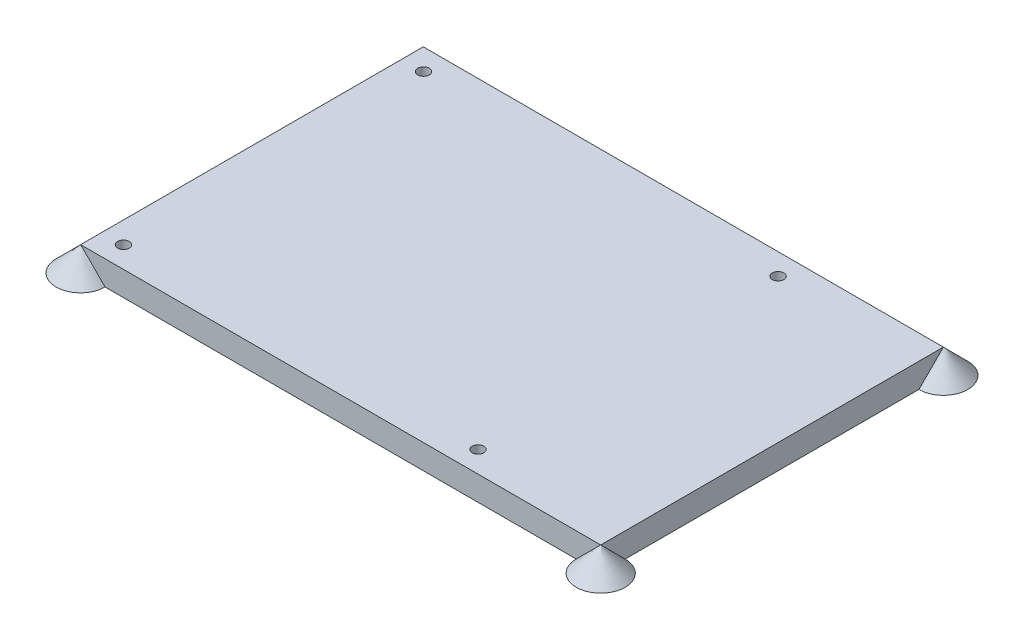
ISO-10303-21;
HEADER;
FILE_DESCRIPTION(('STEP AP214'),'2;1');
FILE_NAME('part.step','',(''),(''),'','','');
FILE_SCHEMA(('AUTOMOTIVE_DESIGN { 1 0 10303 214 1 1 1 1 }'));
ENDSEC;
DATA;
#1=APPLICATION_CONTEXT('core data for automotive mechanical design processes');
#2=APPLICATION_PROTOCOL_DEFINITION('international standard','automotive_design',2000,#1);
#3=PRODUCT_CONTEXT('',#1,'mechanical');
#4=PRODUCT('Part','Part','',(#3));
#5=PRODUCT_RELATED_PRODUCT_CATEGORY('part','',(#4));
#6=PRODUCT_DEFINITION_FORMATION('','',#4);
#7=PRODUCT_DEFINITION_CONTEXT('part definition',#1,'design');
#8=PRODUCT_DEFINITION('design','',#6,#7);
#9=PRODUCT_DEFINITION_SHAPE('','',#8);
#10=(LENGTH_UNIT() NAMED_UNIT(*) SI_UNIT(.MILLI.,.METRE.));
#11=(NAMED_UNIT(*) PLANE_ANGLE_UNIT() SI_UNIT($,.RADIAN.));
#12=(NAMED_UNIT(*) SI_UNIT($,.STERADIAN.) SOLID_ANGLE_UNIT());
#13=UNCERTAINTY_MEASURE_WITH_UNIT(LENGTH_MEASURE(1.E-05),#10,'distance_accuracy_value','');
#14=(GEOMETRIC_REPRESENTATION_CONTEXT(3) GLOBAL_UNCERTAINTY_ASSIGNED_CONTEXT((#13)) GLOBAL_UNIT_ASSIGNED_CONTEXT((#10,
#11,#12)) REPRESENTATION_CONTEXT('',''));
#15=CARTESIAN_POINT('',(0.,0.,0.));
#16=DIRECTION('',(0.,0.,1.));
#17=DIRECTION('',(1.,0.,0.));
#18=AXIS2_PLACEMENT_3D('',#15,#16,#17);
#19=CARTESIAN_POINT('',(42.5,4.,28.));
#20=DIRECTION('',(-1.,0.,0.));
#21=DIRECTION('',(0.,0.,1.));
#22=AXIS2_PLACEMENT_3D('',#19,#20,#21);
#23=PLANE('',#22);
#24=DIRECTION('',(0.,0.707106781186547,-0.707106781186548));
#25=VECTOR('',#24,1.);
#26=CARTESIAN_POINT('',(42.5,4.,-28.));
#27=LINE('',#26,#25);
#28=CARTESIAN_POINT('',(42.5,4.,-28.));
#29=VERTEX_POINT('',#28);
#30=CARTESIAN_POINT('',(42.5,0.,-24.));
#31=VERTEX_POINT('',#30);
#32=EDGE_CURVE('E129',#29,#31,#27,.F.);
#33=ORIENTED_EDGE('',*,*,#32,.F.);
#34=DIRECTION('',(0.,0.,-1.));
#35=VECTOR('',#34,1.);
#36=CARTESIAN_POINT('',(42.5,4.,28.));
#37=LINE('',#36,#35);
#38=CARTESIAN_POINT('',(42.5,4.,28.));
#39=VERTEX_POINT('',#38);
#40=EDGE_CURVE('E112',#39,#29,#37,.T.);
#41=ORIENTED_EDGE('',*,*,#40,.F.);
#42=DIRECTION('',(0.,-0.707106781186547,-0.707106781186548));
#43=VECTOR('',#42,1.);
#44=CARTESIAN_POINT('',(42.5,4.,28.));
#45=LINE('',#44,#43);
#46=CARTESIAN_POINT('',(42.5,0.,24.));
#47=VERTEX_POINT('',#46);
#48=EDGE_CURVE('E11',#47,#39,#45,.F.);
#49=ORIENTED_EDGE('',*,*,#48,.F.);
#50=DIRECTION('',(0.,0.,-1.));
#51=VECTOR('',#50,1.);
#52=CARTESIAN_POINT('',(42.5,0.,28.));
#53=LINE('',#52,#51);
#54=EDGE_CURVE('E68',#47,#31,#53,.T.);
#55=ORIENTED_EDGE('',*,*,#54,.T.);
#56=EDGE_LOOP('',(#33,#41,#49,#55));
#57=FACE_BOUND('',#56,.T.);
#58=ADVANCED_FACE('F45',(#57),#23,.F.);
#59=CARTESIAN_POINT('',(-42.5,4.,-28.));
#60=DIRECTION('',(0.,0.,1.));
#61=DIRECTION('',(1.,0.,0.));
#62=AXIS2_PLACEMENT_3D('',#59,#60,#61);
#63=PLANE('',#62);
#64=DIRECTION('',(-0.707106781186548,-0.707106781186547,0.));
#65=VECTOR('',#64,1.);
#66=CARTESIAN_POINT('',(42.5,4.,-28.));
#67=LINE('',#66,#65);
#68=CARTESIAN_POINT('',(38.5,0.,-28.));
#69=VERTEX_POINT('',#68);
#70=EDGE_CURVE('E60',#69,#29,#67,.F.);
#71=ORIENTED_EDGE('',*,*,#70,.F.);
#72=DIRECTION('',(-1.,0.,0.));
#73=VECTOR('',#72,1.);
#74=CARTESIAN_POINT('',(-42.5,0.,-28.));
#75=LINE('',#74,#73);
#76=CARTESIAN_POINT('',(-38.5,0.,-28.));
#77=VERTEX_POINT('',#76);
#78=EDGE_CURVE('E313',#69,#77,#75,.T.);
#79=ORIENTED_EDGE('',*,*,#78,.T.);
#80=DIRECTION('',(-0.707106781186548,0.707106781186547,0.));
#81=VECTOR('',#80,1.);
#82=CARTESIAN_POINT('',(-42.5,4.,-28.));
#83=LINE('',#82,#81);
#84=CARTESIAN_POINT('',(-42.5,4.,-28.));
#85=VERTEX_POINT('',#84);
#86=EDGE_CURVE('E125',#85,#77,#83,.F.);
#87=ORIENTED_EDGE('',*,*,#86,.F.);
#88=DIRECTION('',(-1.,0.,0.));
#89=VECTOR('',#88,1.);
#90=CARTESIAN_POINT('',(-42.5,4.,-28.));
#91=LINE('',#90,#89);
#92=EDGE_CURVE('E116',#29,#85,#91,.T.);
#93=ORIENTED_EDGE('',*,*,#92,.F.);
#94=EDGE_LOOP('',(#71,#79,#87,#93));
#95=FACE_BOUND('',#94,.T.);
#96=ADVANCED_FACE('F123',(#95),#63,.F.);
#97=CARTESIAN_POINT('',(-42.5,4.,28.));
#98=DIRECTION('',(0.,0.,-1.));
#99=DIRECTION('',(-1.,0.,0.));
#100=AXIS2_PLACEMENT_3D('',#97,#98,#99);
#101=PLANE('',#100);
#102=DIRECTION('',(0.707106781186548,0.707106781186547,0.));
#103=VECTOR('',#102,1.);
#104=CARTESIAN_POINT('',(42.5,4.,28.));
#105=LINE('',#104,#103);
#106=CARTESIAN_POINT('',(38.5,0.,28.));
#107=VERTEX_POINT('',#106);
#108=EDGE_CURVE('E146',#39,#107,#105,.F.);
#109=ORIENTED_EDGE('',*,*,#108,.F.);
#110=DIRECTION('',(1.,0.,0.));
#111=VECTOR('',#110,1.);
#112=CARTESIAN_POINT('',(-42.5,4.,28.));
#113=LINE('',#112,#111);
#114=CARTESIAN_POINT('',(-42.5,4.,28.));
#115=VERTEX_POINT('',#114);
#116=EDGE_CURVE('E118',#115,#39,#113,.T.);
#117=ORIENTED_EDGE('',*,*,#116,.F.);
#118=DIRECTION('',(0.707106781186548,-0.707106781186547,0.));
#119=VECTOR('',#118,1.);
#120=CARTESIAN_POINT('',(-42.5,4.,28.));
#121=LINE('',#120,#119);
#122=CARTESIAN_POINT('',(-38.5,0.,28.));
#123=VERTEX_POINT('',#122);
#124=EDGE_CURVE('E164',#123,#115,#121,.F.);
#125=ORIENTED_EDGE('',*,*,#124,.F.);
#126=DIRECTION('',(1.,0.,0.));
#127=VECTOR('',#126,1.);
#128=CARTESIAN_POINT('',(-42.5,0.,28.));
#129=LINE('',#128,#127);
#130=EDGE_CURVE('E121',#123,#107,#129,.T.);
#131=ORIENTED_EDGE('',*,*,#130,.T.);
#132=EDGE_LOOP('',(#109,#117,#125,#131));
#133=FACE_BOUND('',#132,.T.);
#134=ADVANCED_FACE('F209',(#133),#101,.F.);
#135=CARTESIAN_POINT('',(-42.5,4.,28.));
#136=DIRECTION('',(1.,0.,0.));
#137=DIRECTION('',(0.,0.,-1.));
#138=AXIS2_PLACEMENT_3D('',#135,#136,#137);
#139=PLANE('',#138);
#140=DIRECTION('',(0.,-0.707106781186547,0.707106781186548));
#141=VECTOR('',#140,1.);
#142=CARTESIAN_POINT('',(-42.5,4.,-28.));
#143=LINE('',#142,#141);
#144=CARTESIAN_POINT('',(-42.5,0.,-24.));
#145=VERTEX_POINT('',#144);
#146=EDGE_CURVE('E156',#145,#85,#143,.F.);
#147=ORIENTED_EDGE('',*,*,#146,.F.);
#148=DIRECTION('',(0.,0.,1.));
#149=VECTOR('',#148,1.);
#150=CARTESIAN_POINT('',(-42.5,0.,28.));
#151=LINE('',#150,#149);
#152=CARTESIAN_POINT('',(-42.5,0.,24.));
#153=VERTEX_POINT('',#152);
#154=EDGE_CURVE('E308',#145,#153,#151,.T.);
#155=ORIENTED_EDGE('',*,*,#154,.T.);
#156=DIRECTION('',(0.,0.707106781186547,0.707106781186548));
#157=VECTOR('',#156,1.);
#158=CARTESIAN_POINT('',(-42.5,4.,28.));
#159=LINE('',#158,#157);
#160=EDGE_CURVE('E168',#115,#153,#159,.F.);
#161=ORIENTED_EDGE('',*,*,#160,.F.);
#162=DIRECTION('',(0.,0.,1.));
#163=VECTOR('',#162,1.);
#164=CARTESIAN_POINT('',(-42.5,4.,28.));
#165=LINE('',#164,#163);
#166=EDGE_CURVE('E127',#85,#115,#165,.T.);
#167=ORIENTED_EDGE('',*,*,#166,.F.);
#168=EDGE_LOOP('',(#147,#155,#161,#167));
#169=FACE_BOUND('',#168,.T.);
#170=ADVANCED_FACE('F278',(#169),#139,.F.);
#171=CARTESIAN_POINT('',(-38.98,4.,-24.52));
#172=DIRECTION('',(0.,-1.,0.));
#173=DIRECTION('',(0.,0.,-1.));
#174=AXIS2_PLACEMENT_3D('',#171,#172,#173);
#175=CYLINDRICAL_SURFACE('',#174,0.950000000000001);
#176=CARTESIAN_POINT('',(-38.98,4.,-24.52));
#177=DIRECTION('',(0.,1.,0.));
#178=DIRECTION('',(0.,0.,-1.));
#179=AXIS2_PLACEMENT_3D('',#176,#177,#178);
#180=CIRCLE('',#179,0.950000000000001);
#181=CARTESIAN_POINT('',(-38.98,4.,-25.47));
#182=VERTEX_POINT('',#181);
#183=EDGE_CURVE('E173',#182,#182,#180,.T.);
#184=ORIENTED_EDGE('',*,*,#183,.T.);
#185=EDGE_LOOP('',(#184));
#186=FACE_BOUND('',#185,.T.);
#187=CARTESIAN_POINT('',(-38.98,0.,-24.52));
#188=DIRECTION('',(0.,1.,0.));
#189=DIRECTION('',(0.,0.,-1.));
#190=AXIS2_PLACEMENT_3D('',#187,#188,#189);
#191=CIRCLE('',#190,0.950000000000001);
#192=CARTESIAN_POINT('',(-39.6668957060178,0.,-25.1762577916142));
#193=VERTEX_POINT('',#192);
#194=CARTESIAN_POINT('',(-39.6440649156764,0.,-25.1993510048331));
#195=VERTEX_POINT('',#194);
#196=EDGE_CURVE('E172',#193,#195,#191,.T.);
#197=ORIENTED_EDGE('',*,*,#196,.F.);
#198=CARTESIAN_POINT('',(-39.6440649156764,0.,-25.1993510048331));
#199=DIRECTION('',(-0.703054692657972,0.,0.711135781079538));
#200=VECTOR('',#199,1.);
#201=LINE('',#198,#200);
#202=EDGE_CURVE('E53',#195,#193,#201,.T.);
#203=ORIENTED_EDGE('',*,*,#202,.F.);
#204=EDGE_LOOP('',(#197,#203));
#205=FACE_BOUND('',#204,.T.);
#206=ADVANCED_FACE('F224',(#186,#205),#175,.F.);
#207=CARTESIAN_POINT('',(-38.98,4.,24.52));
#208=DIRECTION('',(0.,-1.,0.));
#209=DIRECTION('',(0.,0.,-1.));
#210=AXIS2_PLACEMENT_3D('',#207,#208,#209);
#211=CYLINDRICAL_SURFACE('',#210,0.950000000000001);
#212=CARTESIAN_POINT('',(-38.98,4.,24.52));
#213=DIRECTION('',(0.,1.,0.));
#214=DIRECTION('',(0.,0.,1.));
#215=AXIS2_PLACEMENT_3D('',#212,#213,#214);
#216=CIRCLE('',#215,0.950000000000001);
#217=CARTESIAN_POINT('',(-38.98,4.,25.47));
#218=VERTEX_POINT('',#217);
#219=EDGE_CURVE('E247',#218,#218,#216,.T.);
#220=ORIENTED_EDGE('',*,*,#219,.T.);
#221=EDGE_LOOP('',(#220));
#222=FACE_BOUND('',#221,.T.);
#223=CARTESIAN_POINT('',(-38.98,0.,24.52));
#224=DIRECTION('',(0.,1.,0.));
#225=DIRECTION('',(0.,0.,1.));
#226=AXIS2_PLACEMENT_3D('',#223,#224,#225);
#227=CIRCLE('',#226,0.950000000000001);
#228=CARTESIAN_POINT('',(-39.6440649156761,0.,25.1993510048334));
#229=VERTEX_POINT('',#228);
#230=CARTESIAN_POINT('',(-39.6668957060177,0.,25.1762577916143));
#231=VERTEX_POINT('',#230);
#232=EDGE_CURVE('E243',#229,#231,#227,.T.);
#233=ORIENTED_EDGE('',*,*,#232,.F.);
#234=CARTESIAN_POINT('',(-39.6668957060177,0.,25.1762577916143));
#235=DIRECTION('',(0.703054692658165,0.,0.711135781079347));
#236=VECTOR('',#235,1.);
#237=LINE('',#234,#236);
#238=EDGE_CURVE('E226',#231,#229,#237,.T.);
#239=ORIENTED_EDGE('',*,*,#238,.F.);
#240=EDGE_LOOP('',(#233,#239));
#241=FACE_BOUND('',#240,.T.);
#242=ADVANCED_FACE('F258',(#222,#241),#211,.F.);
#243=CARTESIAN_POINT('',(0.,4.,0.));
#244=DIRECTION('',(0.,-1.,0.));
#245=DIRECTION('',(0.,0.,-1.));
#246=AXIS2_PLACEMENT_3D('',#243,#244,#245);
#247=PLANE('',#246);
#248=ORIENTED_EDGE('',*,*,#40,.T.);
#249=ORIENTED_EDGE('',*,*,#92,.T.);
#250=ORIENTED_EDGE('',*,*,#166,.T.);
#251=ORIENTED_EDGE('',*,*,#116,.T.);
#252=EDGE_LOOP('',(#248,#249,#250,#251));
#253=FACE_BOUND('',#252,.T.);
#254=ORIENTED_EDGE('',*,*,#219,.F.);
#255=EDGE_LOOP('',(#254));
#256=FACE_BOUND('',#255,.T.);
#257=CARTESIAN_POINT('',(18.96,4.,24.52));
#258=DIRECTION('',(0.,1.,0.));
#259=DIRECTION('',(0.,0.,-1.));
#260=AXIS2_PLACEMENT_3D('',#257,#258,#259);
#261=CIRCLE('',#260,0.950000000000001);
#262=CARTESIAN_POINT('',(18.96,4.,23.57));
#263=VERTEX_POINT('',#262);
#264=EDGE_CURVE('E238',#263,#263,#261,.T.);
#265=ORIENTED_EDGE('',*,*,#264,.F.);
#266=EDGE_LOOP('',(#265));
#267=FACE_BOUND('',#266,.T.);
#268=CARTESIAN_POINT('',(18.96,4.,-24.52));
#269=DIRECTION('',(0.,1.,0.));
#270=DIRECTION('',(0.,0.,1.));
#271=AXIS2_PLACEMENT_3D('',#268,#269,#270);
#272=CIRCLE('',#271,0.950000000000001);
#273=CARTESIAN_POINT('',(18.96,4.,-23.57));
#274=VERTEX_POINT('',#273);
#275=EDGE_CURVE('E180',#274,#274,#272,.T.);
#276=ORIENTED_EDGE('',*,*,#275,.F.);
#277=EDGE_LOOP('',(#276));
#278=FACE_BOUND('',#277,.T.);
#279=ORIENTED_EDGE('',*,*,#183,.F.);
#280=EDGE_LOOP('',(#279));
#281=FACE_BOUND('',#280,.T.);
#282=ADVANCED_FACE('F113',(#253,#256,#267,#278,#281),#247,.F.);
#283=CARTESIAN_POINT('',(0.,0.,0.));
#284=DIRECTION('',(0.,-1.,0.));
#285=DIRECTION('',(0.,0.,-1.));
#286=AXIS2_PLACEMENT_3D('',#283,#284,#285);
#287=PLANE('',#286);
#288=ORIENTED_EDGE('',*,*,#78,.F.);
#289=CARTESIAN_POINT('',(42.5,0.,-28.));
#290=DIRECTION('',(0.,-1.,0.));
#291=DIRECTION('',(0.,0.,1.));
#292=AXIS2_PLACEMENT_3D('',#289,#290,#291);
#293=CIRCLE('',#292,4.00000000000001);
#294=EDGE_CURVE('E137',#69,#31,#293,.T.);
#295=ORIENTED_EDGE('',*,*,#294,.T.);
#296=ORIENTED_EDGE('',*,*,#54,.F.);
#297=CARTESIAN_POINT('',(42.5,0.,28.));
#298=DIRECTION('',(0.,1.,0.));
#299=DIRECTION('',(0.,0.,-1.));
#300=AXIS2_PLACEMENT_3D('',#297,#298,#299);
#301=CIRCLE('',#300,4.00000000000001);
#302=EDGE_CURVE('E134',#107,#47,#301,.T.);
#303=ORIENTED_EDGE('',*,*,#302,.F.);
#304=ORIENTED_EDGE('',*,*,#130,.F.);
#305=CARTESIAN_POINT('',(-42.5,0.,28.));
#306=DIRECTION('',(0.,-1.,0.));
#307=DIRECTION('',(0.,0.,-1.));
#308=AXIS2_PLACEMENT_3D('',#305,#306,#307);
#309=CIRCLE('',#308,4.00000000000001);
#310=EDGE_CURVE('E160',#123,#153,#309,.T.);
#311=ORIENTED_EDGE('',*,*,#310,.T.);
#312=ORIENTED_EDGE('',*,*,#154,.F.);
#313=CARTESIAN_POINT('',(-42.5,0.,-28.));
#314=DIRECTION('',(0.,1.,0.));
#315=DIRECTION('',(0.,0.,1.));
#316=AXIS2_PLACEMENT_3D('',#313,#314,#315);
#317=CIRCLE('',#316,4.00000000000001);
#318=EDGE_CURVE('E150',#77,#145,#317,.T.);
#319=ORIENTED_EDGE('',*,*,#318,.F.);
#320=EDGE_LOOP('',(#288,#295,#296,#303,#304,#311,#312,#319));
#321=FACE_BOUND('',#320,.T.);
#322=ORIENTED_EDGE('',*,*,#202,.T.);
#323=ORIENTED_EDGE('',*,*,#196,.T.);
#324=EDGE_LOOP('',(#322,#323));
#325=FACE_BOUND('',#324,.T.);
#326=ORIENTED_EDGE('',*,*,#238,.T.);
#327=ORIENTED_EDGE('',*,*,#232,.T.);
#328=EDGE_LOOP('',(#326,#327));
#329=FACE_BOUND('',#328,.T.);
#330=CARTESIAN_POINT('',(18.96,0.,-24.52));
#331=DIRECTION('',(0.,1.,0.));
#332=DIRECTION('',(0.,0.,1.));
#333=AXIS2_PLACEMENT_3D('',#330,#331,#332);
#334=CIRCLE('',#333,0.950000000000001);
#335=CARTESIAN_POINT('',(18.96,0.,-23.57));
#336=VERTEX_POINT('',#335);
#337=EDGE_CURVE('E177',#336,#336,#334,.T.);
#338=ORIENTED_EDGE('',*,*,#337,.T.);
#339=EDGE_LOOP('',(#338));
#340=FACE_BOUND('',#339,.T.);
#341=CARTESIAN_POINT('',(18.96,0.,24.52));
#342=DIRECTION('',(0.,1.,0.));
#343=DIRECTION('',(0.,0.,-1.));
#344=AXIS2_PLACEMENT_3D('',#341,#342,#343);
#345=CIRCLE('',#344,0.950000000000001);
#346=CARTESIAN_POINT('',(18.96,0.,23.57));
#347=VERTEX_POINT('',#346);
#348=EDGE_CURVE('E235',#347,#347,#345,.T.);
#349=ORIENTED_EDGE('',*,*,#348,.T.);
#350=EDGE_LOOP('',(#349));
#351=FACE_BOUND('',#350,.T.);
#352=ADVANCED_FACE('F196',(#321,#325,#329,#340,#351),#287,.T.);
#353=CARTESIAN_POINT('',(18.96,4.,24.52));
#354=DIRECTION('',(0.,-1.,0.));
#355=DIRECTION('',(0.,0.,-1.));
#356=AXIS2_PLACEMENT_3D('',#353,#354,#355);
#357=CYLINDRICAL_SURFACE('',#356,0.950000000000001);
#358=ORIENTED_EDGE('',*,*,#264,.T.);
#359=EDGE_LOOP('',(#358));
#360=FACE_BOUND('',#359,.T.);
#361=ORIENTED_EDGE('',*,*,#348,.F.);
#362=EDGE_LOOP('',(#361));
#363=FACE_BOUND('',#362,.T.);
#364=ADVANCED_FACE('F206',(#360,#363),#357,.F.);
#365=CARTESIAN_POINT('',(18.96,4.,-24.52));
#366=DIRECTION('',(0.,-1.,0.));
#367=DIRECTION('',(0.,0.,-1.));
#368=AXIS2_PLACEMENT_3D('',#365,#366,#367);
#369=CYLINDRICAL_SURFACE('',#368,0.950000000000001);
#370=ORIENTED_EDGE('',*,*,#275,.T.);
#371=EDGE_LOOP('',(#370));
#372=FACE_BOUND('',#371,.T.);
#373=ORIENTED_EDGE('',*,*,#337,.F.);
#374=EDGE_LOOP('',(#373));
#375=FACE_BOUND('',#374,.T.);
#376=ADVANCED_FACE('F270',(#372,#375),#369,.F.);
#377=CARTESIAN_POINT('',(-42.5,4.,28.));
#378=DIRECTION('',(0.,-1.,0.));
#379=DIRECTION('',(0.,0.,-1.));
#380=AXIS2_PLACEMENT_3D('',#377,#378,#379);
#381=CONICAL_SURFACE('',#380,0.,0.785398163397449);
#382=ORIENTED_EDGE('',*,*,#124,.T.);
#383=ORIENTED_EDGE('',*,*,#160,.T.);
#384=ORIENTED_EDGE('',*,*,#310,.F.);
#385=EDGE_LOOP('',(#382,#383,#384));
#386=FACE_BOUND('',#385,.T.);
#387=ADVANCED_FACE('F273',(#386),#381,.T.);
#388=CARTESIAN_POINT('',(-42.5,4.,-28.));
#389=DIRECTION('',(0.,-1.,0.));
#390=DIRECTION('',(0.,0.,1.));
#391=AXIS2_PLACEMENT_3D('',#388,#389,#390);
#392=CONICAL_SURFACE('',#391,0.,0.785398163397449);
#393=ORIENTED_EDGE('',*,*,#318,.T.);
#394=ORIENTED_EDGE('',*,*,#146,.T.);
#395=ORIENTED_EDGE('',*,*,#86,.T.);
#396=EDGE_LOOP('',(#393,#394,#395));
#397=FACE_BOUND('',#396,.T.);
#398=ADVANCED_FACE('F282',(#397),#392,.T.);
#399=CARTESIAN_POINT('',(42.5,4.,28.));
#400=DIRECTION('',(0.,-1.,0.));
#401=DIRECTION('',(0.,0.,-1.));
#402=AXIS2_PLACEMENT_3D('',#399,#400,#401);
#403=CONICAL_SURFACE('',#402,0.,0.785398163397449);
#404=ORIENTED_EDGE('',*,*,#48,.T.);
#405=ORIENTED_EDGE('',*,*,#108,.T.);
#406=ORIENTED_EDGE('',*,*,#302,.T.);
#407=EDGE_LOOP('',(#404,#405,#406));
#408=FACE_BOUND('',#407,.T.);
#409=ADVANCED_FACE('F286',(#408),#403,.T.);
#410=CARTESIAN_POINT('',(42.5,4.,-28.));
#411=DIRECTION('',(0.,-1.,0.));
#412=DIRECTION('',(0.,0.,1.));
#413=AXIS2_PLACEMENT_3D('',#410,#411,#412);
#414=CONICAL_SURFACE('',#413,0.,0.785398163397449);
#415=ORIENTED_EDGE('',*,*,#70,.T.);
#416=ORIENTED_EDGE('',*,*,#32,.T.);
#417=ORIENTED_EDGE('',*,*,#294,.F.);
#418=EDGE_LOOP('',(#415,#416,#417));
#419=FACE_BOUND('',#418,.T.);
#420=ADVANCED_FACE('F136',(#419),#414,.T.);
#421=CLOSED_SHELL('',(#58,#96,#134,#170,#206,#242,#282,#352,#364,#376,#387,#398,#409,#420));
#422=MANIFOLD_SOLID_BREP('B2',#421);
#423=ADVANCED_BREP_SHAPE_REPRESENTATION('',(#18,#422),#14);
#424=SHAPE_DEFINITION_REPRESENTATION(#9,#423);
ENDSEC;
END-ISO-10303-21;
